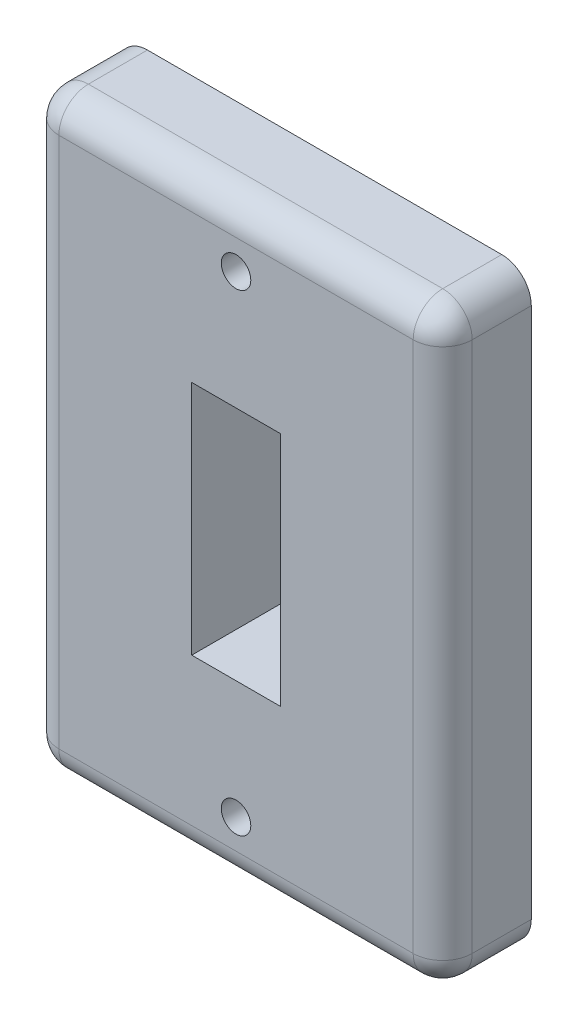
ISO-10303-21;
HEADER;
FILE_DESCRIPTION(('STEP AP214'),'2;1');
FILE_NAME('part.step','',(''),(''),'','','');
FILE_SCHEMA(('AUTOMOTIVE_DESIGN { 1 0 10303 214 1 1 1 1 }'));
ENDSEC;
DATA;
#1=APPLICATION_CONTEXT('core data for automotive mechanical design processes');
#2=APPLICATION_PROTOCOL_DEFINITION('international standard','automotive_design',2000,#1);
#3=PRODUCT_CONTEXT('',#1,'mechanical');
#4=PRODUCT('Part','Part','',(#3));
#5=PRODUCT_RELATED_PRODUCT_CATEGORY('part','',(#4));
#6=PRODUCT_DEFINITION_FORMATION('','',#4);
#7=PRODUCT_DEFINITION_CONTEXT('part definition',#1,'design');
#8=PRODUCT_DEFINITION('design','',#6,#7);
#9=PRODUCT_DEFINITION_SHAPE('','',#8);
#10=(LENGTH_UNIT() NAMED_UNIT(*) SI_UNIT(.MILLI.,.METRE.));
#11=(NAMED_UNIT(*) PLANE_ANGLE_UNIT() SI_UNIT($,.RADIAN.));
#12=(NAMED_UNIT(*) SI_UNIT($,.STERADIAN.) SOLID_ANGLE_UNIT());
#13=UNCERTAINTY_MEASURE_WITH_UNIT(LENGTH_MEASURE(1.E-05),#10,'distance_accuracy_value','');
#14=(GEOMETRIC_REPRESENTATION_CONTEXT(3) GLOBAL_UNCERTAINTY_ASSIGNED_CONTEXT((#13)) GLOBAL_UNIT_ASSIGNED_CONTEXT((#10,
#11,#12)) REPRESENTATION_CONTEXT('',''));
#15=CARTESIAN_POINT('',(0.,0.,0.));
#16=DIRECTION('',(0.,0.,1.));
#17=DIRECTION('',(1.,0.,0.));
#18=AXIS2_PLACEMENT_3D('',#15,#16,#17);
#19=CARTESIAN_POINT('',(0.,40.,0.));
#20=DIRECTION('',(0.,0.,1.));
#21=DIRECTION('',(1.,0.,0.));
#22=AXIS2_PLACEMENT_3D('',#19,#20,#21);
#23=CYLINDRICAL_SURFACE('',#22,2.5);
#24=CARTESIAN_POINT('',(0.,40.,15.));
#25=DIRECTION('',(0.,0.,1.));
#26=DIRECTION('',(1.,0.,0.));
#27=AXIS2_PLACEMENT_3D('',#24,#25,#26);
#28=CIRCLE('',#27,2.5);
#29=CARTESIAN_POINT('',(2.49999999999999,40.,15.));
#30=VERTEX_POINT('',#29);
#31=EDGE_CURVE('E176',#30,#30,#28,.T.);
#32=ORIENTED_EDGE('',*,*,#31,.T.);
#33=EDGE_LOOP('',(#32));
#34=FACE_BOUND('',#33,.T.);
#35=CARTESIAN_POINT('',(0.,40.,2.));
#36=DIRECTION('',(0.,0.,-1.));
#37=DIRECTION('',(-1.,0.,0.));
#38=AXIS2_PLACEMENT_3D('',#35,#36,#37);
#39=CIRCLE('',#38,2.5);
#40=CARTESIAN_POINT('',(-2.50000000000001,40.,2.));
#41=VERTEX_POINT('',#40);
#42=EDGE_CURVE('E229',#41,#41,#39,.F.);
#43=ORIENTED_EDGE('',*,*,#42,.F.);
#44=EDGE_LOOP('',(#43));
#45=FACE_BOUND('',#44,.T.);
#46=ADVANCED_FACE('F43',(#34,#45),#23,.F.);
#47=CARTESIAN_POINT('',(0.,-40.,0.));
#48=DIRECTION('',(0.,0.,1.));
#49=DIRECTION('',(1.,0.,0.));
#50=AXIS2_PLACEMENT_3D('',#47,#48,#49);
#51=CYLINDRICAL_SURFACE('',#50,2.5);
#52=CARTESIAN_POINT('',(0.,-40.,15.));
#53=DIRECTION('',(0.,0.,1.));
#54=DIRECTION('',(1.,0.,0.));
#55=AXIS2_PLACEMENT_3D('',#52,#53,#54);
#56=CIRCLE('',#55,2.5);
#57=CARTESIAN_POINT('',(2.49999999999999,-40.,15.));
#58=VERTEX_POINT('',#57);
#59=EDGE_CURVE('E183',#58,#58,#56,.T.);
#60=ORIENTED_EDGE('',*,*,#59,.T.);
#61=EDGE_LOOP('',(#60));
#62=FACE_BOUND('',#61,.T.);
#63=CARTESIAN_POINT('',(0.,-40.,2.));
#64=DIRECTION('',(0.,0.,-1.));
#65=DIRECTION('',(-1.,0.,0.));
#66=AXIS2_PLACEMENT_3D('',#63,#64,#65);
#67=CIRCLE('',#66,2.5);
#68=CARTESIAN_POINT('',(-2.50000000000001,-40.,2.));
#69=VERTEX_POINT('',#68);
#70=EDGE_CURVE('E226',#69,#69,#67,.F.);
#71=ORIENTED_EDGE('',*,*,#70,.F.);
#72=EDGE_LOOP('',(#71));
#73=FACE_BOUND('',#72,.T.);
#74=ADVANCED_FACE('F352',(#62,#73),#51,.F.);
#75=CARTESIAN_POINT('',(35.,-50.,15.));
#76=DIRECTION('',(-1.,0.,0.));
#77=DIRECTION('',(0.,0.,1.));
#78=AXIS2_PLACEMENT_3D('',#75,#76,#77);
#79=PLANE('',#78);
#80=DIRECTION('',(0.,1.,0.));
#81=VECTOR('',#80,1.);
#82=CARTESIAN_POINT('',(35.,-50.,10.));
#83=LINE('',#82,#81);
#84=CARTESIAN_POINT('',(35.,45.,10.));
#85=VERTEX_POINT('',#84);
#86=CARTESIAN_POINT('',(35.,-45.,10.));
#87=VERTEX_POINT('',#86);
#88=EDGE_CURVE('E218',#85,#87,#83,.F.);
#89=ORIENTED_EDGE('',*,*,#88,.T.);
#90=DIRECTION('',(0.,0.,-1.));
#91=VECTOR('',#90,1.);
#92=CARTESIAN_POINT('',(35.,-45.,15.));
#93=LINE('',#92,#91);
#94=CARTESIAN_POINT('',(35.,-45.,0.));
#95=VERTEX_POINT('',#94);
#96=EDGE_CURVE('E254',#87,#95,#93,.T.);
#97=ORIENTED_EDGE('',*,*,#96,.T.);
#98=DIRECTION('',(0.,1.,0.));
#99=VECTOR('',#98,1.);
#100=CARTESIAN_POINT('',(35.,-50.,0.));
#101=LINE('',#100,#99);
#102=CARTESIAN_POINT('',(35.,45.,0.));
#103=VERTEX_POINT('',#102);
#104=EDGE_CURVE('E189',#95,#103,#101,.T.);
#105=ORIENTED_EDGE('',*,*,#104,.T.);
#106=DIRECTION('',(0.,0.,-1.));
#107=VECTOR('',#106,1.);
#108=CARTESIAN_POINT('',(35.,45.,15.));
#109=LINE('',#108,#107);
#110=EDGE_CURVE('E252',#103,#85,#109,.F.);
#111=ORIENTED_EDGE('',*,*,#110,.T.);
#112=EDGE_LOOP('',(#89,#97,#105,#111));
#113=FACE_BOUND('',#112,.T.);
#114=ADVANCED_FACE('F295',(#113),#79,.F.);
#115=CARTESIAN_POINT('',(-35.,50.,15.));
#116=DIRECTION('',(0.,-1.,0.));
#117=DIRECTION('',(0.,0.,-1.));
#118=AXIS2_PLACEMENT_3D('',#115,#116,#117);
#119=PLANE('',#118);
#120=DIRECTION('',(-1.,0.,0.));
#121=VECTOR('',#120,1.);
#122=CARTESIAN_POINT('',(-35.,50.,0.));
#123=LINE('',#122,#121);
#124=CARTESIAN_POINT('',(30.,50.,0.));
#125=VERTEX_POINT('',#124);
#126=CARTESIAN_POINT('',(-30.,50.,0.));
#127=VERTEX_POINT('',#126);
#128=EDGE_CURVE('E195',#125,#127,#123,.T.);
#129=ORIENTED_EDGE('',*,*,#128,.T.);
#130=DIRECTION('',(0.,0.,-1.));
#131=VECTOR('',#130,1.);
#132=CARTESIAN_POINT('',(-30.,50.,15.));
#133=LINE('',#132,#131);
#134=CARTESIAN_POINT('',(-30.,50.,10.));
#135=VERTEX_POINT('',#134);
#136=EDGE_CURVE('E11',#127,#135,#133,.F.);
#137=ORIENTED_EDGE('',*,*,#136,.T.);
#138=DIRECTION('',(-1.,0.,0.));
#139=VECTOR('',#138,1.);
#140=CARTESIAN_POINT('',(-35.,50.,10.));
#141=LINE('',#140,#139);
#142=CARTESIAN_POINT('',(30.,50.,10.));
#143=VERTEX_POINT('',#142);
#144=EDGE_CURVE('E221',#135,#143,#141,.F.);
#145=ORIENTED_EDGE('',*,*,#144,.T.);
#146=DIRECTION('',(0.,0.,-1.));
#147=VECTOR('',#146,1.);
#148=CARTESIAN_POINT('',(30.,50.,15.));
#149=LINE('',#148,#147);
#150=EDGE_CURVE('E52',#143,#125,#149,.T.);
#151=ORIENTED_EDGE('',*,*,#150,.T.);
#152=EDGE_LOOP('',(#129,#137,#145,#151));
#153=FACE_BOUND('',#152,.T.);
#154=ADVANCED_FACE('F348',(#153),#119,.F.);
#155=CARTESIAN_POINT('',(-35.,-50.,15.));
#156=DIRECTION('',(1.,0.,0.));
#157=DIRECTION('',(0.,0.,-1.));
#158=AXIS2_PLACEMENT_3D('',#155,#156,#157);
#159=PLANE('',#158);
#160=DIRECTION('',(0.,-1.,0.));
#161=VECTOR('',#160,1.);
#162=CARTESIAN_POINT('',(-35.,-50.,0.));
#163=LINE('',#162,#161);
#164=CARTESIAN_POINT('',(-35.,45.,0.));
#165=VERTEX_POINT('',#164);
#166=CARTESIAN_POINT('',(-35.,-45.,0.));
#167=VERTEX_POINT('',#166);
#168=EDGE_CURVE('E197',#165,#167,#163,.T.);
#169=ORIENTED_EDGE('',*,*,#168,.T.);
#170=DIRECTION('',(0.,0.,-1.));
#171=VECTOR('',#170,1.);
#172=CARTESIAN_POINT('',(-35.,-45.,15.));
#173=LINE('',#172,#171);
#174=CARTESIAN_POINT('',(-35.,-45.,10.));
#175=VERTEX_POINT('',#174);
#176=EDGE_CURVE('E269',#167,#175,#173,.F.);
#177=ORIENTED_EDGE('',*,*,#176,.T.);
#178=DIRECTION('',(0.,-1.,0.));
#179=VECTOR('',#178,1.);
#180=CARTESIAN_POINT('',(-35.,-50.,10.));
#181=LINE('',#180,#179);
#182=CARTESIAN_POINT('',(-35.,45.,10.));
#183=VERTEX_POINT('',#182);
#184=EDGE_CURVE('E223',#175,#183,#181,.F.);
#185=ORIENTED_EDGE('',*,*,#184,.T.);
#186=DIRECTION('',(0.,0.,-1.));
#187=VECTOR('',#186,1.);
#188=CARTESIAN_POINT('',(-35.,45.,15.));
#189=LINE('',#188,#187);
#190=EDGE_CURVE('E267',#183,#165,#189,.T.);
#191=ORIENTED_EDGE('',*,*,#190,.T.);
#192=EDGE_LOOP('',(#169,#177,#185,#191));
#193=FACE_BOUND('',#192,.T.);
#194=ADVANCED_FACE('F329',(#193),#159,.F.);
#195=CARTESIAN_POINT('',(-35.,-50.,15.));
#196=DIRECTION('',(0.,1.,0.));
#197=DIRECTION('',(0.,0.,1.));
#198=AXIS2_PLACEMENT_3D('',#195,#196,#197);
#199=PLANE('',#198);
#200=DIRECTION('',(1.,0.,0.));
#201=VECTOR('',#200,1.);
#202=CARTESIAN_POINT('',(-35.,-50.,0.));
#203=LINE('',#202,#201);
#204=CARTESIAN_POINT('',(-30.,-50.,0.));
#205=VERTEX_POINT('',#204);
#206=CARTESIAN_POINT('',(30.,-50.,0.));
#207=VERTEX_POINT('',#206);
#208=EDGE_CURVE('E200',#205,#207,#203,.T.);
#209=ORIENTED_EDGE('',*,*,#208,.T.);
#210=DIRECTION('',(0.,0.,-1.));
#211=VECTOR('',#210,1.);
#212=CARTESIAN_POINT('',(30.,-50.,15.));
#213=LINE('',#212,#211);
#214=CARTESIAN_POINT('',(30.,-50.,10.));
#215=VERTEX_POINT('',#214);
#216=EDGE_CURVE('E265',#207,#215,#213,.F.);
#217=ORIENTED_EDGE('',*,*,#216,.T.);
#218=DIRECTION('',(1.,0.,0.));
#219=VECTOR('',#218,1.);
#220=CARTESIAN_POINT('',(-35.,-50.,10.));
#221=LINE('',#220,#219);
#222=CARTESIAN_POINT('',(-30.,-50.,10.));
#223=VERTEX_POINT('',#222);
#224=EDGE_CURVE('E215',#215,#223,#221,.F.);
#225=ORIENTED_EDGE('',*,*,#224,.T.);
#226=DIRECTION('',(0.,0.,-1.));
#227=VECTOR('',#226,1.);
#228=CARTESIAN_POINT('',(-30.,-50.,15.));
#229=LINE('',#228,#227);
#230=EDGE_CURVE('E263',#223,#205,#229,.T.);
#231=ORIENTED_EDGE('',*,*,#230,.T.);
#232=EDGE_LOOP('',(#209,#217,#225,#231));
#233=FACE_BOUND('',#232,.T.);
#234=ADVANCED_FACE('F340',(#233),#199,.F.);
#235=CARTESIAN_POINT('',(0.,0.,15.));
#236=DIRECTION('',(0.,0.,-1.));
#237=DIRECTION('',(-1.,0.,0.));
#238=AXIS2_PLACEMENT_3D('',#235,#236,#237);
#239=PLANE('',#238);
#240=DIRECTION('',(0.,-1.,0.));
#241=VECTOR('',#240,1.);
#242=CARTESIAN_POINT('',(-30.,0.,15.));
#243=LINE('',#242,#241);
#244=CARTESIAN_POINT('',(-30.,45.,15.));
#245=VERTEX_POINT('',#244);
#246=CARTESIAN_POINT('',(-30.,-45.,15.));
#247=VERTEX_POINT('',#246);
#248=EDGE_CURVE('E203',#245,#247,#243,.T.);
#249=ORIENTED_EDGE('',*,*,#248,.T.);
#250=DIRECTION('',(1.,0.,0.));
#251=VECTOR('',#250,1.);
#252=CARTESIAN_POINT('',(0.,-45.,15.));
#253=LINE('',#252,#251);
#254=CARTESIAN_POINT('',(30.,-45.,15.));
#255=VERTEX_POINT('',#254);
#256=EDGE_CURVE('E212',#247,#255,#253,.T.);
#257=ORIENTED_EDGE('',*,*,#256,.T.);
#258=DIRECTION('',(0.,1.,0.));
#259=VECTOR('',#258,1.);
#260=CARTESIAN_POINT('',(30.,0.,15.));
#261=LINE('',#260,#259);
#262=CARTESIAN_POINT('',(30.,45.,15.));
#263=VERTEX_POINT('',#262);
#264=EDGE_CURVE('E209',#255,#263,#261,.T.);
#265=ORIENTED_EDGE('',*,*,#264,.T.);
#266=DIRECTION('',(-1.,0.,0.));
#267=VECTOR('',#266,1.);
#268=CARTESIAN_POINT('',(0.,45.,15.));
#269=LINE('',#268,#267);
#270=EDGE_CURVE('E206',#263,#245,#269,.T.);
#271=ORIENTED_EDGE('',*,*,#270,.T.);
#272=EDGE_LOOP('',(#249,#257,#265,#271));
#273=FACE_BOUND('',#272,.T.);
#274=ORIENTED_EDGE('',*,*,#59,.F.);
#275=EDGE_LOOP('',(#274));
#276=FACE_BOUND('',#275,.T.);
#277=ORIENTED_EDGE('',*,*,#31,.F.);
#278=EDGE_LOOP('',(#277));
#279=FACE_BOUND('',#278,.T.);
#280=DIRECTION('',(-1.,0.,0.));
#281=VECTOR('',#280,1.);
#282=CARTESIAN_POINT('',(-7.5,20.,15.));
#283=LINE('',#282,#281);
#284=CARTESIAN_POINT('',(7.5,20.,15.));
#285=VERTEX_POINT('',#284);
#286=CARTESIAN_POINT('',(-7.5,20.,15.));
#287=VERTEX_POINT('',#286);
#288=EDGE_CURVE('E182',#285,#287,#283,.T.);
#289=ORIENTED_EDGE('',*,*,#288,.F.);
#290=DIRECTION('',(0.,1.,0.));
#291=VECTOR('',#290,1.);
#292=CARTESIAN_POINT('',(7.5,-20.,15.));
#293=LINE('',#292,#291);
#294=CARTESIAN_POINT('',(7.5,-20.,15.));
#295=VERTEX_POINT('',#294);
#296=EDGE_CURVE('E153',#295,#285,#293,.T.);
#297=ORIENTED_EDGE('',*,*,#296,.F.);
#298=DIRECTION('',(1.,0.,0.));
#299=VECTOR('',#298,1.);
#300=CARTESIAN_POINT('',(-7.5,-20.,15.));
#301=LINE('',#300,#299);
#302=CARTESIAN_POINT('',(-7.5,-20.,15.));
#303=VERTEX_POINT('',#302);
#304=EDGE_CURVE('E170',#303,#295,#301,.T.);
#305=ORIENTED_EDGE('',*,*,#304,.F.);
#306=DIRECTION('',(0.,-1.,0.));
#307=VECTOR('',#306,1.);
#308=CARTESIAN_POINT('',(-7.5,-20.,15.));
#309=LINE('',#308,#307);
#310=EDGE_CURVE('E173',#287,#303,#309,.T.);
#311=ORIENTED_EDGE('',*,*,#310,.F.);
#312=EDGE_LOOP('',(#289,#297,#305,#311));
#313=FACE_BOUND('',#312,.T.);
#314=ADVANCED_FACE('F315',(#273,#276,#279,#313),#239,.F.);
#315=CARTESIAN_POINT('',(0.,0.,0.));
#316=DIRECTION('',(0.,0.,-1.));
#317=DIRECTION('',(-1.,0.,0.));
#318=AXIS2_PLACEMENT_3D('',#315,#316,#317);
#319=PLANE('',#318);
#320=DIRECTION('',(0.,1.,0.));
#321=VECTOR('',#320,1.);
#322=CARTESIAN_POINT('',(7.5,-20.,0.));
#323=LINE('',#322,#321);
#324=CARTESIAN_POINT('',(7.5,-20.,0.));
#325=VERTEX_POINT('',#324);
#326=CARTESIAN_POINT('',(7.5,20.,0.));
#327=VERTEX_POINT('',#326);
#328=EDGE_CURVE('E150',#325,#327,#323,.T.);
#329=ORIENTED_EDGE('',*,*,#328,.T.);
#330=DIRECTION('',(-1.,0.,0.));
#331=VECTOR('',#330,1.);
#332=CARTESIAN_POINT('',(-7.5,20.,0.));
#333=LINE('',#332,#331);
#334=CARTESIAN_POINT('',(-7.5,20.,0.));
#335=VERTEX_POINT('',#334);
#336=EDGE_CURVE('E162',#327,#335,#333,.T.);
#337=ORIENTED_EDGE('',*,*,#336,.T.);
#338=DIRECTION('',(0.,-1.,0.));
#339=VECTOR('',#338,1.);
#340=CARTESIAN_POINT('',(-7.5,-20.,0.));
#341=LINE('',#340,#339);
#342=CARTESIAN_POINT('',(-7.5,-20.,0.));
#343=VERTEX_POINT('',#342);
#344=EDGE_CURVE('E166',#335,#343,#341,.T.);
#345=ORIENTED_EDGE('',*,*,#344,.T.);
#346=DIRECTION('',(1.,0.,0.));
#347=VECTOR('',#346,1.);
#348=CARTESIAN_POINT('',(-7.5,-20.,0.));
#349=LINE('',#348,#347);
#350=EDGE_CURVE('E158',#343,#325,#349,.T.);
#351=ORIENTED_EDGE('',*,*,#350,.T.);
#352=EDGE_LOOP('',(#329,#337,#345,#351));
#353=FACE_BOUND('',#352,.T.);
#354=ORIENTED_EDGE('',*,*,#104,.F.);
#355=CARTESIAN_POINT('',(30.,-45.,0.));
#356=DIRECTION('',(0.,0.,-1.));
#357=DIRECTION('',(-1.,0.,0.));
#358=AXIS2_PLACEMENT_3D('',#355,#356,#357);
#359=CIRCLE('',#358,5.);
#360=EDGE_CURVE('E261',#95,#207,#359,.T.);
#361=ORIENTED_EDGE('',*,*,#360,.T.);
#362=ORIENTED_EDGE('',*,*,#208,.F.);
#363=CARTESIAN_POINT('',(-30.,-45.,0.));
#364=DIRECTION('',(0.,0.,-1.));
#365=DIRECTION('',(-1.,0.,0.));
#366=AXIS2_PLACEMENT_3D('',#363,#364,#365);
#367=CIRCLE('',#366,5.);
#368=EDGE_CURVE('E259',#205,#167,#367,.T.);
#369=ORIENTED_EDGE('',*,*,#368,.T.);
#370=ORIENTED_EDGE('',*,*,#168,.F.);
#371=CARTESIAN_POINT('',(-30.,45.,0.));
#372=DIRECTION('',(0.,0.,-1.));
#373=DIRECTION('',(-1.,0.,0.));
#374=AXIS2_PLACEMENT_3D('',#371,#372,#373);
#375=CIRCLE('',#374,5.);
#376=EDGE_CURVE('E60',#165,#127,#375,.T.);
#377=ORIENTED_EDGE('',*,*,#376,.T.);
#378=ORIENTED_EDGE('',*,*,#128,.F.);
#379=CARTESIAN_POINT('',(30.,45.,0.));
#380=DIRECTION('',(0.,0.,-1.));
#381=DIRECTION('',(-1.,0.,0.));
#382=AXIS2_PLACEMENT_3D('',#379,#380,#381);
#383=CIRCLE('',#382,5.);
#384=EDGE_CURVE('E256',#125,#103,#383,.T.);
#385=ORIENTED_EDGE('',*,*,#384,.T.);
#386=EDGE_LOOP('',(#354,#361,#362,#369,#370,#377,#378,#385));
#387=FACE_BOUND('',#386,.T.);
#388=CARTESIAN_POINT('',(0.,-40.,0.));
#389=DIRECTION('',(0.,0.,-1.));
#390=DIRECTION('',(-1.,0.,0.));
#391=AXIS2_PLACEMENT_3D('',#388,#389,#390);
#392=CIRCLE('',#391,1.);
#393=CARTESIAN_POINT('',(-1.00000000000001,-40.,0.));
#394=VERTEX_POINT('',#393);
#395=EDGE_CURVE('E601',#394,#394,#392,.T.);
#396=ORIENTED_EDGE('',*,*,#395,.F.);
#397=EDGE_LOOP('',(#396));
#398=FACE_BOUND('',#397,.T.);
#399=CARTESIAN_POINT('',(0.,40.,0.));
#400=DIRECTION('',(0.,0.,-1.));
#401=DIRECTION('',(-1.,0.,0.));
#402=AXIS2_PLACEMENT_3D('',#399,#400,#401);
#403=CIRCLE('',#402,1.);
#404=CARTESIAN_POINT('',(-1.00000000000001,40.,0.));
#405=VERTEX_POINT('',#404);
#406=EDGE_CURVE('E604',#405,#405,#403,.T.);
#407=ORIENTED_EDGE('',*,*,#406,.F.);
#408=EDGE_LOOP('',(#407));
#409=FACE_BOUND('',#408,.T.);
#410=ADVANCED_FACE('F168',(#353,#387,#398,#409),#319,.T.);
#411=CARTESIAN_POINT('',(7.5,-20.,0.));
#412=DIRECTION('',(1.,0.,0.));
#413=DIRECTION('',(0.,0.,-1.));
#414=AXIS2_PLACEMENT_3D('',#411,#412,#413);
#415=PLANE('',#414);
#416=ORIENTED_EDGE('',*,*,#296,.T.);
#417=DIRECTION('',(0.,0.,1.));
#418=VECTOR('',#417,1.);
#419=CARTESIAN_POINT('',(7.5,20.,0.));
#420=LINE('',#419,#418);
#421=EDGE_CURVE('E146',#327,#285,#420,.T.);
#422=ORIENTED_EDGE('',*,*,#421,.F.);
#423=ORIENTED_EDGE('',*,*,#328,.F.);
#424=DIRECTION('',(0.,0.,1.));
#425=VECTOR('',#424,1.);
#426=CARTESIAN_POINT('',(7.5,-20.,0.));
#427=LINE('',#426,#425);
#428=EDGE_CURVE('E187',#325,#295,#427,.T.);
#429=ORIENTED_EDGE('',*,*,#428,.T.);
#430=EDGE_LOOP('',(#416,#422,#423,#429));
#431=FACE_BOUND('',#430,.T.);
#432=ADVANCED_FACE('F148',(#431),#415,.F.);
#433=CARTESIAN_POINT('',(-7.5,-20.,0.));
#434=DIRECTION('',(0.,-1.,0.));
#435=DIRECTION('',(0.,0.,-1.));
#436=AXIS2_PLACEMENT_3D('',#433,#434,#435);
#437=PLANE('',#436);
#438=ORIENTED_EDGE('',*,*,#304,.T.);
#439=ORIENTED_EDGE('',*,*,#428,.F.);
#440=ORIENTED_EDGE('',*,*,#350,.F.);
#441=DIRECTION('',(0.,0.,1.));
#442=VECTOR('',#441,1.);
#443=CARTESIAN_POINT('',(-7.5,-20.,0.));
#444=LINE('',#443,#442);
#445=EDGE_CURVE('E190',#343,#303,#444,.T.);
#446=ORIENTED_EDGE('',*,*,#445,.T.);
#447=EDGE_LOOP('',(#438,#439,#440,#446));
#448=FACE_BOUND('',#447,.T.);
#449=ADVANCED_FACE('F365',(#448),#437,.F.);
#450=CARTESIAN_POINT('',(-7.5,-20.,0.));
#451=DIRECTION('',(-1.,0.,0.));
#452=DIRECTION('',(0.,0.,1.));
#453=AXIS2_PLACEMENT_3D('',#450,#451,#452);
#454=PLANE('',#453);
#455=ORIENTED_EDGE('',*,*,#310,.T.);
#456=ORIENTED_EDGE('',*,*,#445,.F.);
#457=ORIENTED_EDGE('',*,*,#344,.F.);
#458=DIRECTION('',(0.,0.,1.));
#459=VECTOR('',#458,1.);
#460=CARTESIAN_POINT('',(-7.5,20.,0.));
#461=LINE('',#460,#459);
#462=EDGE_CURVE('E157',#335,#287,#461,.T.);
#463=ORIENTED_EDGE('',*,*,#462,.T.);
#464=EDGE_LOOP('',(#455,#456,#457,#463));
#465=FACE_BOUND('',#464,.T.);
#466=ADVANCED_FACE('F368',(#465),#454,.F.);
#467=CARTESIAN_POINT('',(-7.5,20.,0.));
#468=DIRECTION('',(0.,1.,0.));
#469=DIRECTION('',(0.,0.,1.));
#470=AXIS2_PLACEMENT_3D('',#467,#468,#469);
#471=PLANE('',#470);
#472=ORIENTED_EDGE('',*,*,#288,.T.);
#473=ORIENTED_EDGE('',*,*,#462,.F.);
#474=ORIENTED_EDGE('',*,*,#336,.F.);
#475=ORIENTED_EDGE('',*,*,#421,.T.);
#476=EDGE_LOOP('',(#472,#473,#474,#475));
#477=FACE_BOUND('',#476,.T.);
#478=ADVANCED_FACE('F163',(#477),#471,.F.);
#479=CARTESIAN_POINT('',(0.,45.,10.));
#480=DIRECTION('',(-1.,0.,0.));
#481=DIRECTION('',(0.,0.,1.));
#482=AXIS2_PLACEMENT_3D('',#479,#480,#481);
#483=CYLINDRICAL_SURFACE('',#482,5.);
#484=ORIENTED_EDGE('',*,*,#144,.F.);
#485=CARTESIAN_POINT('',(-30.,45.,10.));
#486=DIRECTION('',(-1.,0.,0.));
#487=DIRECTION('',(0.,0.,1.));
#488=AXIS2_PLACEMENT_3D('',#485,#486,#487);
#489=CIRCLE('',#488,5.);
#490=EDGE_CURVE('E250',#135,#245,#489,.F.);
#491=ORIENTED_EDGE('',*,*,#490,.T.);
#492=ORIENTED_EDGE('',*,*,#270,.F.);
#493=CARTESIAN_POINT('',(30.,45.,10.));
#494=DIRECTION('',(-1.,0.,0.));
#495=DIRECTION('',(0.,0.,1.));
#496=AXIS2_PLACEMENT_3D('',#493,#494,#495);
#497=CIRCLE('',#496,5.);
#498=EDGE_CURVE('E248',#263,#143,#497,.T.);
#499=ORIENTED_EDGE('',*,*,#498,.T.);
#500=EDGE_LOOP('',(#484,#491,#492,#499));
#501=FACE_BOUND('',#500,.T.);
#502=ADVANCED_FACE('F374',(#501),#483,.T.);
#503=CARTESIAN_POINT('',(-30.,0.,10.));
#504=DIRECTION('',(0.,-1.,0.));
#505=DIRECTION('',(0.,0.,-1.));
#506=AXIS2_PLACEMENT_3D('',#503,#504,#505);
#507=CYLINDRICAL_SURFACE('',#506,5.);
#508=ORIENTED_EDGE('',*,*,#184,.F.);
#509=CARTESIAN_POINT('',(-30.,-45.,10.));
#510=DIRECTION('',(0.,-1.,0.));
#511=DIRECTION('',(0.,0.,-1.));
#512=AXIS2_PLACEMENT_3D('',#509,#510,#511);
#513=CIRCLE('',#512,5.);
#514=EDGE_CURVE('E246',#175,#247,#513,.F.);
#515=ORIENTED_EDGE('',*,*,#514,.T.);
#516=ORIENTED_EDGE('',*,*,#248,.F.);
#517=CARTESIAN_POINT('',(-30.,45.,10.));
#518=DIRECTION('',(0.,-1.,0.));
#519=DIRECTION('',(0.,0.,-1.));
#520=AXIS2_PLACEMENT_3D('',#517,#518,#519);
#521=CIRCLE('',#520,5.);
#522=EDGE_CURVE('E243',#245,#183,#521,.T.);
#523=ORIENTED_EDGE('',*,*,#522,.T.);
#524=EDGE_LOOP('',(#508,#515,#516,#523));
#525=FACE_BOUND('',#524,.T.);
#526=ADVANCED_FACE('F320',(#525),#507,.T.);
#527=CARTESIAN_POINT('',(30.,0.,10.));
#528=DIRECTION('',(0.,1.,0.));
#529=DIRECTION('',(0.,0.,1.));
#530=AXIS2_PLACEMENT_3D('',#527,#528,#529);
#531=CYLINDRICAL_SURFACE('',#530,5.);
#532=ORIENTED_EDGE('',*,*,#264,.F.);
#533=CARTESIAN_POINT('',(30.,-45.,10.));
#534=DIRECTION('',(0.,1.,0.));
#535=DIRECTION('',(0.,0.,1.));
#536=AXIS2_PLACEMENT_3D('',#533,#534,#535);
#537=CIRCLE('',#536,5.);
#538=EDGE_CURVE('E241',#255,#87,#537,.T.);
#539=ORIENTED_EDGE('',*,*,#538,.T.);
#540=ORIENTED_EDGE('',*,*,#88,.F.);
#541=CARTESIAN_POINT('',(30.,45.,10.));
#542=DIRECTION('',(0.,1.,0.));
#543=DIRECTION('',(0.,0.,1.));
#544=AXIS2_PLACEMENT_3D('',#541,#542,#543);
#545=CIRCLE('',#544,5.);
#546=EDGE_CURVE('E238',#85,#263,#545,.F.);
#547=ORIENTED_EDGE('',*,*,#546,.T.);
#548=EDGE_LOOP('',(#532,#539,#540,#547));
#549=FACE_BOUND('',#548,.T.);
#550=ADVANCED_FACE('F312',(#549),#531,.T.);
#551=CARTESIAN_POINT('',(0.,-45.,10.));
#552=DIRECTION('',(1.,0.,0.));
#553=DIRECTION('',(0.,0.,-1.));
#554=AXIS2_PLACEMENT_3D('',#551,#552,#553);
#555=CYLINDRICAL_SURFACE('',#554,5.);
#556=ORIENTED_EDGE('',*,*,#224,.F.);
#557=CARTESIAN_POINT('',(30.,-45.,10.));
#558=DIRECTION('',(1.,0.,0.));
#559=DIRECTION('',(0.,0.,-1.));
#560=AXIS2_PLACEMENT_3D('',#557,#558,#559);
#561=CIRCLE('',#560,5.);
#562=EDGE_CURVE('E235',#215,#255,#561,.F.);
#563=ORIENTED_EDGE('',*,*,#562,.T.);
#564=ORIENTED_EDGE('',*,*,#256,.F.);
#565=CARTESIAN_POINT('',(-30.,-45.,10.));
#566=DIRECTION('',(1.,0.,0.));
#567=DIRECTION('',(0.,0.,-1.));
#568=AXIS2_PLACEMENT_3D('',#565,#566,#567);
#569=CIRCLE('',#568,5.);
#570=EDGE_CURVE('E232',#247,#223,#569,.T.);
#571=ORIENTED_EDGE('',*,*,#570,.T.);
#572=EDGE_LOOP('',(#556,#563,#564,#571));
#573=FACE_BOUND('',#572,.T.);
#574=ADVANCED_FACE('F309',(#573),#555,.T.);
#575=CARTESIAN_POINT('',(0.,-40.,2.));
#576=DIRECTION('',(0.,0.,-1.));
#577=DIRECTION('',(-1.,0.,0.));
#578=AXIS2_PLACEMENT_3D('',#575,#576,#577);
#579=PLANE('',#578);
#580=CARTESIAN_POINT('',(0.,-40.,2.));
#581=DIRECTION('',(0.,0.,-1.));
#582=DIRECTION('',(-1.,0.,0.));
#583=AXIS2_PLACEMENT_3D('',#580,#581,#582);
#584=CIRCLE('',#583,1.);
#585=CARTESIAN_POINT('',(-1.00000000000001,-40.,2.));
#586=VERTEX_POINT('',#585);
#587=EDGE_CURVE('E275',#586,#586,#584,.T.);
#588=ORIENTED_EDGE('',*,*,#587,.T.);
#589=EDGE_LOOP('',(#588));
#590=FACE_BOUND('',#589,.T.);
#591=ORIENTED_EDGE('',*,*,#70,.T.);
#592=EDGE_LOOP('',(#591));
#593=FACE_BOUND('',#592,.T.);
#594=ADVANCED_FACE('F411',(#590,#593),#579,.F.);
#595=CARTESIAN_POINT('',(0.,-40.,2.));
#596=DIRECTION('',(0.,0.,-1.));
#597=DIRECTION('',(-1.,0.,0.));
#598=AXIS2_PLACEMENT_3D('',#595,#596,#597);
#599=CYLINDRICAL_SURFACE('',#598,1.);
#600=ORIENTED_EDGE('',*,*,#587,.F.);
#601=EDGE_LOOP('',(#600));
#602=FACE_BOUND('',#601,.T.);
#603=ORIENTED_EDGE('',*,*,#395,.T.);
#604=EDGE_LOOP('',(#603));
#605=FACE_BOUND('',#604,.T.);
#606=ADVANCED_FACE('F501',(#602,#605),#599,.F.);
#607=CARTESIAN_POINT('',(0.,40.,2.));
#608=DIRECTION('',(0.,0.,-1.));
#609=DIRECTION('',(-1.,0.,0.));
#610=AXIS2_PLACEMENT_3D('',#607,#608,#609);
#611=PLANE('',#610);
#612=CARTESIAN_POINT('',(0.,40.,2.));
#613=DIRECTION('',(0.,0.,-1.));
#614=DIRECTION('',(-1.,0.,0.));
#615=AXIS2_PLACEMENT_3D('',#612,#613,#614);
#616=CIRCLE('',#615,1.);
#617=CARTESIAN_POINT('',(-1.00000000000001,40.,2.));
#618=VERTEX_POINT('',#617);
#619=EDGE_CURVE('E609',#618,#618,#616,.T.);
#620=ORIENTED_EDGE('',*,*,#619,.T.);
#621=EDGE_LOOP('',(#620));
#622=FACE_BOUND('',#621,.T.);
#623=ORIENTED_EDGE('',*,*,#42,.T.);
#624=EDGE_LOOP('',(#623));
#625=FACE_BOUND('',#624,.T.);
#626=ADVANCED_FACE('F492',(#622,#625),#611,.F.);
#627=CARTESIAN_POINT('',(0.,40.,2.));
#628=DIRECTION('',(0.,0.,-1.));
#629=DIRECTION('',(-1.,0.,0.));
#630=AXIS2_PLACEMENT_3D('',#627,#628,#629);
#631=CYLINDRICAL_SURFACE('',#630,1.);
#632=ORIENTED_EDGE('',*,*,#619,.F.);
#633=EDGE_LOOP('',(#632));
#634=FACE_BOUND('',#633,.T.);
#635=ORIENTED_EDGE('',*,*,#406,.T.);
#636=EDGE_LOOP('',(#635));
#637=FACE_BOUND('',#636,.T.);
#638=ADVANCED_FACE('F420',(#634,#637),#631,.F.);
#639=CARTESIAN_POINT('',(30.,-45.,15.));
#640=DIRECTION('',(0.,0.,-1.));
#641=DIRECTION('',(-1.,0.,0.));
#642=AXIS2_PLACEMENT_3D('',#639,#640,#641);
#643=CYLINDRICAL_SURFACE('',#642,5.);
#644=ORIENTED_EDGE('',*,*,#360,.F.);
#645=ORIENTED_EDGE('',*,*,#96,.F.);
#646=CARTESIAN_POINT('',(30.,-45.,10.));
#647=DIRECTION('',(0.,0.,1.));
#648=DIRECTION('',(1.,0.,0.));
#649=AXIS2_PLACEMENT_3D('',#646,#647,#648);
#650=CIRCLE('',#649,5.);
#651=EDGE_CURVE('E272',#215,#87,#650,.T.);
#652=ORIENTED_EDGE('',*,*,#651,.F.);
#653=ORIENTED_EDGE('',*,*,#216,.F.);
#654=EDGE_LOOP('',(#644,#645,#652,#653));
#655=FACE_BOUND('',#654,.T.);
#656=ADVANCED_FACE('F300',(#655),#643,.T.);
#657=CARTESIAN_POINT('',(30.,-45.,10.));
#658=DIRECTION('',(0.,0.,1.));
#659=DIRECTION('',(1.,0.,0.));
#660=AXIS2_PLACEMENT_3D('',#657,#658,#659);
#661=SPHERICAL_SURFACE('',#660,5.);
#662=ORIENTED_EDGE('',*,*,#651,.T.);
#663=ORIENTED_EDGE('',*,*,#538,.F.);
#664=ORIENTED_EDGE('',*,*,#562,.F.);
#665=EDGE_LOOP('',(#662,#663,#664));
#666=FACE_BOUND('',#665,.T.);
#667=ADVANCED_FACE('F304',(#666),#661,.T.);
#668=CARTESIAN_POINT('',(-30.,-45.,15.));
#669=DIRECTION('',(0.,0.,-1.));
#670=DIRECTION('',(-1.,0.,0.));
#671=AXIS2_PLACEMENT_3D('',#668,#669,#670);
#672=CYLINDRICAL_SURFACE('',#671,5.);
#673=ORIENTED_EDGE('',*,*,#368,.F.);
#674=ORIENTED_EDGE('',*,*,#230,.F.);
#675=CARTESIAN_POINT('',(-30.,-45.,10.));
#676=DIRECTION('',(0.,0.,1.));
#677=DIRECTION('',(1.,0.,0.));
#678=AXIS2_PLACEMENT_3D('',#675,#676,#677);
#679=CIRCLE('',#678,5.);
#680=EDGE_CURVE('E276',#175,#223,#679,.T.);
#681=ORIENTED_EDGE('',*,*,#680,.F.);
#682=ORIENTED_EDGE('',*,*,#176,.F.);
#683=EDGE_LOOP('',(#673,#674,#681,#682));
#684=FACE_BOUND('',#683,.T.);
#685=ADVANCED_FACE('F335',(#684),#672,.T.);
#686=CARTESIAN_POINT('',(-30.,-45.,10.));
#687=DIRECTION('',(0.,0.,1.));
#688=DIRECTION('',(1.,0.,0.));
#689=AXIS2_PLACEMENT_3D('',#686,#687,#688);
#690=SPHERICAL_SURFACE('',#689,5.);
#691=ORIENTED_EDGE('',*,*,#570,.F.);
#692=ORIENTED_EDGE('',*,*,#514,.F.);
#693=ORIENTED_EDGE('',*,*,#680,.T.);
#694=EDGE_LOOP('',(#691,#692,#693));
#695=FACE_BOUND('',#694,.T.);
#696=ADVANCED_FACE('F338',(#695),#690,.T.);
#697=CARTESIAN_POINT('',(-30.,45.,15.));
#698=DIRECTION('',(0.,0.,-1.));
#699=DIRECTION('',(-1.,0.,0.));
#700=AXIS2_PLACEMENT_3D('',#697,#698,#699);
#701=CYLINDRICAL_SURFACE('',#700,5.);
#702=ORIENTED_EDGE('',*,*,#376,.F.);
#703=ORIENTED_EDGE('',*,*,#190,.F.);
#704=CARTESIAN_POINT('',(-30.,45.,10.));
#705=DIRECTION('',(0.,0.,1.));
#706=DIRECTION('',(1.,0.,0.));
#707=AXIS2_PLACEMENT_3D('',#704,#705,#706);
#708=CIRCLE('',#707,5.);
#709=EDGE_CURVE('E277',#135,#183,#708,.T.);
#710=ORIENTED_EDGE('',*,*,#709,.F.);
#711=ORIENTED_EDGE('',*,*,#136,.F.);
#712=EDGE_LOOP('',(#702,#703,#710,#711));
#713=FACE_BOUND('',#712,.T.);
#714=ADVANCED_FACE('F327',(#713),#701,.T.);
#715=CARTESIAN_POINT('',(-30.,45.,10.));
#716=DIRECTION('',(0.,0.,1.));
#717=DIRECTION('',(1.,0.,0.));
#718=AXIS2_PLACEMENT_3D('',#715,#716,#717);
#719=SPHERICAL_SURFACE('',#718,5.);
#720=ORIENTED_EDGE('',*,*,#522,.F.);
#721=ORIENTED_EDGE('',*,*,#490,.F.);
#722=ORIENTED_EDGE('',*,*,#709,.T.);
#723=EDGE_LOOP('',(#720,#721,#722));
#724=FACE_BOUND('',#723,.T.);
#725=ADVANCED_FACE('F322',(#724),#719,.T.);
#726=CARTESIAN_POINT('',(30.,45.,15.));
#727=DIRECTION('',(0.,0.,-1.));
#728=DIRECTION('',(-1.,0.,0.));
#729=AXIS2_PLACEMENT_3D('',#726,#727,#728);
#730=CYLINDRICAL_SURFACE('',#729,5.);
#731=ORIENTED_EDGE('',*,*,#384,.F.);
#732=ORIENTED_EDGE('',*,*,#150,.F.);
#733=CARTESIAN_POINT('',(30.,45.,10.));
#734=DIRECTION('',(0.,0.,1.));
#735=DIRECTION('',(1.,0.,0.));
#736=AXIS2_PLACEMENT_3D('',#733,#734,#735);
#737=CIRCLE('',#736,5.);
#738=EDGE_CURVE('E47',#85,#143,#737,.T.);
#739=ORIENTED_EDGE('',*,*,#738,.F.);
#740=ORIENTED_EDGE('',*,*,#110,.F.);
#741=EDGE_LOOP('',(#731,#732,#739,#740));
#742=FACE_BOUND('',#741,.T.);
#743=ADVANCED_FACE('F45',(#742),#730,.T.);
#744=CARTESIAN_POINT('',(30.,45.,10.));
#745=DIRECTION('',(0.,0.,1.));
#746=DIRECTION('',(1.,0.,0.));
#747=AXIS2_PLACEMENT_3D('',#744,#745,#746);
#748=SPHERICAL_SURFACE('',#747,5.);
#749=ORIENTED_EDGE('',*,*,#738,.T.);
#750=ORIENTED_EDGE('',*,*,#498,.F.);
#751=ORIENTED_EDGE('',*,*,#546,.F.);
#752=EDGE_LOOP('',(#749,#750,#751));
#753=FACE_BOUND('',#752,.T.);
#754=ADVANCED_FACE('F287',(#753),#748,.T.);
#755=CLOSED_SHELL('',(#46,#74,#114,#154,#194,#234,#314,#410,#432,#449,#466,#478,#502,#526,#550,
#574,#594,#606,#626,#638,#656,#667,#685,#696,#714,#725,#743,#754));
#756=MANIFOLD_SOLID_BREP('B2',#755);
#757=ADVANCED_BREP_SHAPE_REPRESENTATION('',(#18,#756),#14);
#758=SHAPE_DEFINITION_REPRESENTATION(#9,#757);
ENDSEC;
END-ISO-10303-21;
